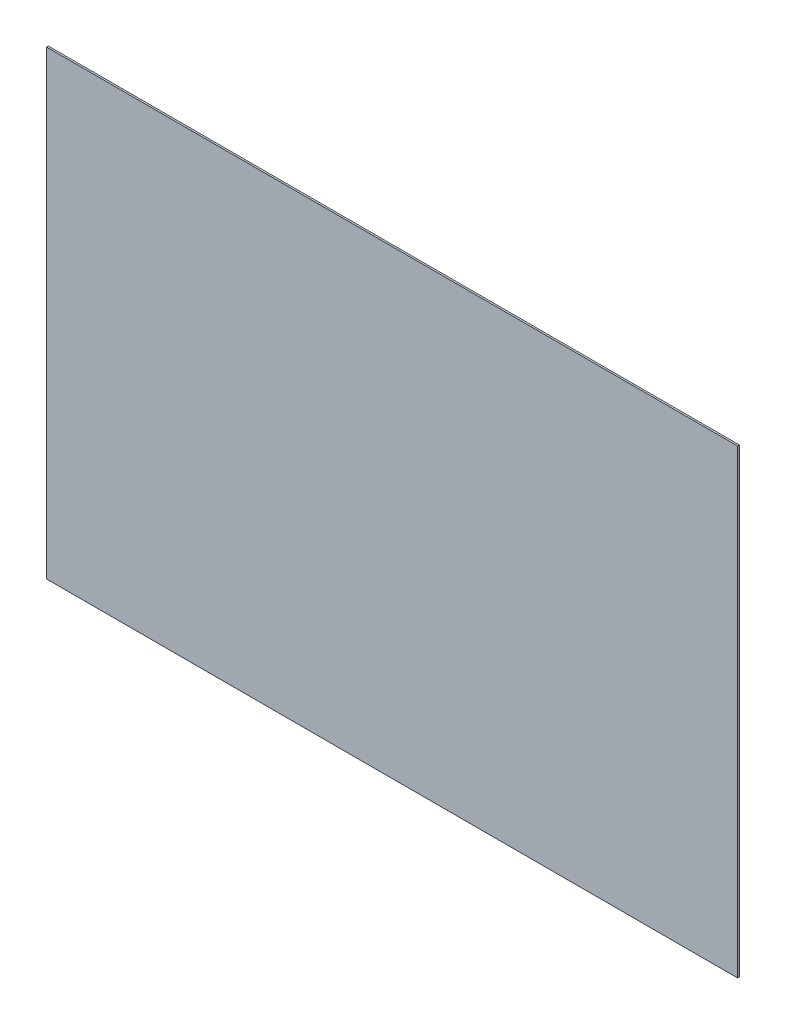
ISO-10303-21;
HEADER;
FILE_DESCRIPTION(('STEP AP214'),'2;1');
FILE_NAME('part.step','',(''),(''),'','','');
FILE_SCHEMA(('AUTOMOTIVE_DESIGN { 1 0 10303 214 1 1 1 1 }'));
ENDSEC;
DATA;
#1=APPLICATION_CONTEXT('core data for automotive mechanical design processes');
#2=APPLICATION_PROTOCOL_DEFINITION('international standard','automotive_design',2000,#1);
#3=PRODUCT_CONTEXT('',#1,'mechanical');
#4=PRODUCT('Part','Part','',(#3));
#5=PRODUCT_RELATED_PRODUCT_CATEGORY('part','',(#4));
#6=PRODUCT_DEFINITION_FORMATION('','',#4);
#7=PRODUCT_DEFINITION_CONTEXT('part definition',#1,'design');
#8=PRODUCT_DEFINITION('design','',#6,#7);
#9=PRODUCT_DEFINITION_SHAPE('','',#8);
#10=(LENGTH_UNIT() NAMED_UNIT(*) SI_UNIT(.MILLI.,.METRE.));
#11=(NAMED_UNIT(*) PLANE_ANGLE_UNIT() SI_UNIT($,.RADIAN.));
#12=(NAMED_UNIT(*) SI_UNIT($,.STERADIAN.) SOLID_ANGLE_UNIT());
#13=UNCERTAINTY_MEASURE_WITH_UNIT(LENGTH_MEASURE(1.E-05),#10,'distance_accuracy_value','');
#14=(GEOMETRIC_REPRESENTATION_CONTEXT(3) GLOBAL_UNCERTAINTY_ASSIGNED_CONTEXT((#13)) GLOBAL_UNIT_ASSIGNED_CONTEXT((#10,
#11,#12)) REPRESENTATION_CONTEXT('',''));
#15=CARTESIAN_POINT('',(0.,0.,0.));
#16=DIRECTION('',(0.,0.,1.));
#17=DIRECTION('',(1.,0.,0.));
#18=AXIS2_PLACEMENT_3D('',#15,#16,#17);
#19=CARTESIAN_POINT('',(177.8,25.4,0.39116));
#20=DIRECTION('',(0.,0.,1.));
#21=DIRECTION('',(1.,0.,0.));
#22=AXIS2_PLACEMENT_3D('',#19,#20,#21);
#23=PLANE('',#22);
#24=DIRECTION('',(0.,1.,0.));
#25=VECTOR('',#24,1.);
#26=CARTESIAN_POINT('',(25.4,25.4,0.39116));
#27=LINE('',#26,#25);
#28=CARTESIAN_POINT('',(25.4,25.4,0.39116));
#29=VERTEX_POINT('',#28);
#30=CARTESIAN_POINT('',(25.4,127.,0.39116));
#31=VERTEX_POINT('',#30);
#32=EDGE_CURVE('E52',#29,#31,#27,.T.);
#33=ORIENTED_EDGE('',*,*,#32,.F.);
#34=DIRECTION('',(1.,0.,0.));
#35=VECTOR('',#34,1.);
#36=CARTESIAN_POINT('',(177.8,25.4,0.39116));
#37=LINE('',#36,#35);
#38=CARTESIAN_POINT('',(177.8,25.4,0.39116));
#39=VERTEX_POINT('',#38);
#40=EDGE_CURVE('E67',#39,#29,#37,.F.);
#41=ORIENTED_EDGE('',*,*,#40,.F.);
#42=DIRECTION('',(0.,1.,0.));
#43=VECTOR('',#42,1.);
#44=CARTESIAN_POINT('',(177.8,127.,0.39116));
#45=LINE('',#44,#43);
#46=CARTESIAN_POINT('',(177.8,127.,0.39116));
#47=VERTEX_POINT('',#46);
#48=EDGE_CURVE('E19',#47,#39,#45,.F.);
#49=ORIENTED_EDGE('',*,*,#48,.F.);
#50=DIRECTION('',(1.,0.,0.));
#51=VECTOR('',#50,1.);
#52=CARTESIAN_POINT('',(25.4,127.,0.39116));
#53=LINE('',#52,#51);
#54=EDGE_CURVE('E57',#31,#47,#53,.T.);
#55=ORIENTED_EDGE('',*,*,#54,.F.);
#56=EDGE_LOOP('',(#33,#41,#49,#55));
#57=FACE_BOUND('',#56,.T.);
#58=ADVANCED_FACE('F16',(#57),#23,.T.);
#59=CARTESIAN_POINT('',(177.8,127.,0.));
#60=DIRECTION('',(1.,0.,0.));
#61=DIRECTION('',(0.,0.,-1.));
#62=AXIS2_PLACEMENT_3D('',#59,#60,#61);
#63=PLANE('',#62);
#64=DIRECTION('',(0.,0.,-1.));
#65=VECTOR('',#64,1.);
#66=CARTESIAN_POINT('',(177.8,25.4,0.));
#67=LINE('',#66,#65);
#68=CARTESIAN_POINT('',(177.8,25.4,0.));
#69=VERTEX_POINT('',#68);
#70=EDGE_CURVE('E78',#69,#39,#67,.F.);
#71=ORIENTED_EDGE('',*,*,#70,.F.);
#72=DIRECTION('',(0.,1.,0.));
#73=VECTOR('',#72,1.);
#74=CARTESIAN_POINT('',(177.8,25.4,0.));
#75=LINE('',#74,#73);
#76=CARTESIAN_POINT('',(177.8,127.,0.));
#77=VERTEX_POINT('',#76);
#78=EDGE_CURVE('E73',#69,#77,#75,.T.);
#79=ORIENTED_EDGE('',*,*,#78,.T.);
#80=DIRECTION('',(0.,0.,1.));
#81=VECTOR('',#80,1.);
#82=CARTESIAN_POINT('',(177.8,127.,0.));
#83=LINE('',#82,#81);
#84=EDGE_CURVE('E62',#47,#77,#83,.F.);
#85=ORIENTED_EDGE('',*,*,#84,.F.);
#86=ORIENTED_EDGE('',*,*,#48,.T.);
#87=EDGE_LOOP('',(#71,#79,#85,#86));
#88=FACE_BOUND('',#87,.T.);
#89=ADVANCED_FACE('F72',(#88),#63,.T.);
#90=CARTESIAN_POINT('',(25.4,127.,0.));
#91=DIRECTION('',(0.,1.,0.));
#92=DIRECTION('',(0.,0.,1.));
#93=AXIS2_PLACEMENT_3D('',#90,#91,#92);
#94=PLANE('',#93);
#95=ORIENTED_EDGE('',*,*,#84,.T.);
#96=DIRECTION('',(1.,0.,0.));
#97=VECTOR('',#96,1.);
#98=CARTESIAN_POINT('',(177.8,127.,0.));
#99=LINE('',#98,#97);
#100=CARTESIAN_POINT('',(25.4,127.,0.));
#101=VERTEX_POINT('',#100);
#102=EDGE_CURVE('E83',#77,#101,#99,.F.);
#103=ORIENTED_EDGE('',*,*,#102,.T.);
#104=DIRECTION('',(0.,0.,1.));
#105=VECTOR('',#104,1.);
#106=CARTESIAN_POINT('',(25.4,127.,0.));
#107=LINE('',#106,#105);
#108=EDGE_CURVE('E64',#31,#101,#107,.F.);
#109=ORIENTED_EDGE('',*,*,#108,.F.);
#110=ORIENTED_EDGE('',*,*,#54,.T.);
#111=EDGE_LOOP('',(#95,#103,#109,#110));
#112=FACE_BOUND('',#111,.T.);
#113=ADVANCED_FACE('F59',(#112),#94,.T.);
#114=CARTESIAN_POINT('',(25.4,25.4,0.));
#115=DIRECTION('',(-1.,0.,0.));
#116=DIRECTION('',(0.,0.,1.));
#117=AXIS2_PLACEMENT_3D('',#114,#115,#116);
#118=PLANE('',#117);
#119=ORIENTED_EDGE('',*,*,#108,.T.);
#120=DIRECTION('',(0.,1.,0.));
#121=VECTOR('',#120,1.);
#122=CARTESIAN_POINT('',(25.4,25.4,0.));
#123=LINE('',#122,#121);
#124=CARTESIAN_POINT('',(25.4,25.4,0.));
#125=VERTEX_POINT('',#124);
#126=EDGE_CURVE('E25',#101,#125,#123,.F.);
#127=ORIENTED_EDGE('',*,*,#126,.T.);
#128=DIRECTION('',(0.,0.,-1.));
#129=VECTOR('',#128,1.);
#130=CARTESIAN_POINT('',(25.4,25.4,0.));
#131=LINE('',#130,#129);
#132=EDGE_CURVE('E33',#29,#125,#131,.T.);
#133=ORIENTED_EDGE('',*,*,#132,.F.);
#134=ORIENTED_EDGE('',*,*,#32,.T.);
#135=EDGE_LOOP('',(#119,#127,#133,#134));
#136=FACE_BOUND('',#135,.T.);
#137=ADVANCED_FACE('F87',(#136),#118,.T.);
#138=CARTESIAN_POINT('',(177.8,25.4,0.));
#139=DIRECTION('',(0.,-1.,0.));
#140=DIRECTION('',(0.,0.,-1.));
#141=AXIS2_PLACEMENT_3D('',#138,#139,#140);
#142=PLANE('',#141);
#143=ORIENTED_EDGE('',*,*,#132,.T.);
#144=DIRECTION('',(1.,0.,0.));
#145=VECTOR('',#144,1.);
#146=CARTESIAN_POINT('',(177.8,25.4,0.));
#147=LINE('',#146,#145);
#148=EDGE_CURVE('E10',#125,#69,#147,.T.);
#149=ORIENTED_EDGE('',*,*,#148,.T.);
#150=ORIENTED_EDGE('',*,*,#70,.T.);
#151=ORIENTED_EDGE('',*,*,#40,.T.);
#152=EDGE_LOOP('',(#143,#149,#150,#151));
#153=FACE_BOUND('',#152,.T.);
#154=ADVANCED_FACE('F90',(#153),#142,.T.);
#155=CARTESIAN_POINT('',(177.8,25.4,0.));
#156=DIRECTION('',(0.,0.,1.));
#157=DIRECTION('',(1.,0.,0.));
#158=AXIS2_PLACEMENT_3D('',#155,#156,#157);
#159=PLANE('',#158);
#160=ORIENTED_EDGE('',*,*,#126,.F.);
#161=ORIENTED_EDGE('',*,*,#102,.F.);
#162=ORIENTED_EDGE('',*,*,#78,.F.);
#163=ORIENTED_EDGE('',*,*,#148,.F.);
#164=EDGE_LOOP('',(#160,#161,#162,#163));
#165=FACE_BOUND('',#164,.T.);
#166=ADVANCED_FACE('F89',(#165),#159,.F.);
#167=CLOSED_SHELL('',(#58,#89,#113,#137,#154,#166));
#168=MANIFOLD_SOLID_BREP('B1',#167);
#169=ADVANCED_BREP_SHAPE_REPRESENTATION('',(#18,#168),#14);
#170=SHAPE_DEFINITION_REPRESENTATION(#9,#169);
ENDSEC;
END-ISO-10303-21;
